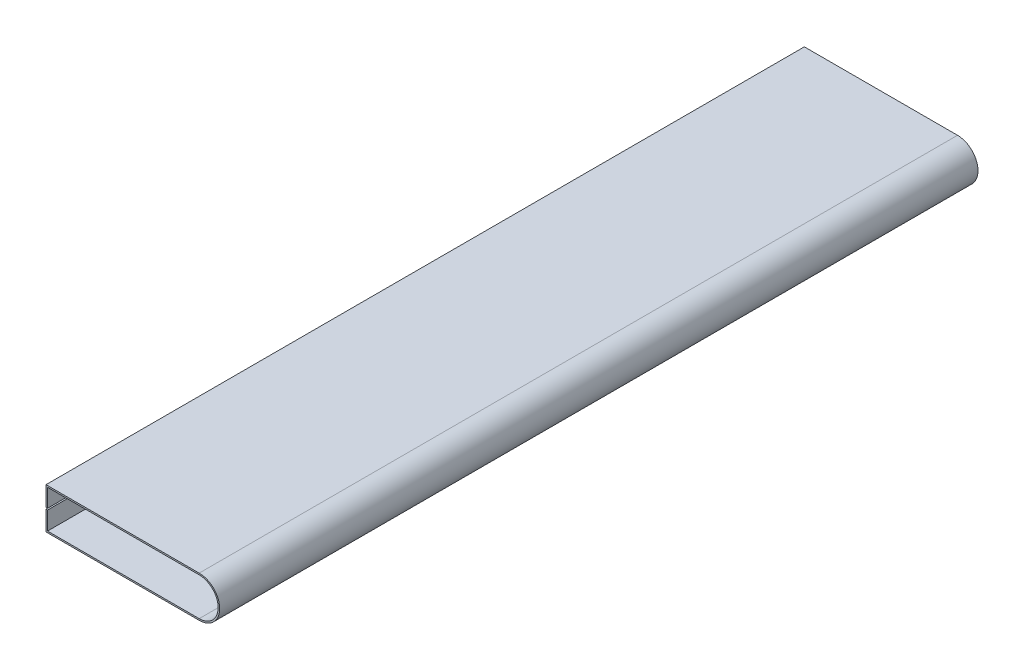
ISO-10303-21;
HEADER;
FILE_DESCRIPTION(('STEP AP214'),'2;1');
FILE_NAME('part.step','',(''),(''),'','','');
FILE_SCHEMA(('AUTOMOTIVE_DESIGN { 1 0 10303 214 1 1 1 1 }'));
ENDSEC;
DATA;
#1=APPLICATION_CONTEXT('core data for automotive mechanical design processes');
#2=APPLICATION_PROTOCOL_DEFINITION('international standard','automotive_design',2000,#1);
#3=PRODUCT_CONTEXT('',#1,'mechanical');
#4=PRODUCT('Part','Part','',(#3));
#5=PRODUCT_RELATED_PRODUCT_CATEGORY('part','',(#4));
#6=PRODUCT_DEFINITION_FORMATION('','',#4);
#7=PRODUCT_DEFINITION_CONTEXT('part definition',#1,'design');
#8=PRODUCT_DEFINITION('design','',#6,#7);
#9=PRODUCT_DEFINITION_SHAPE('','',#8);
#10=(LENGTH_UNIT() NAMED_UNIT(*) SI_UNIT(.MILLI.,.METRE.));
#11=(NAMED_UNIT(*) PLANE_ANGLE_UNIT() SI_UNIT($,.RADIAN.));
#12=(NAMED_UNIT(*) SI_UNIT($,.STERADIAN.) SOLID_ANGLE_UNIT());
#13=UNCERTAINTY_MEASURE_WITH_UNIT(LENGTH_MEASURE(1.E-05),#10,'distance_accuracy_value','');
#14=(GEOMETRIC_REPRESENTATION_CONTEXT(3) GLOBAL_UNCERTAINTY_ASSIGNED_CONTEXT((#13)) GLOBAL_UNIT_ASSIGNED_CONTEXT((#10,
#11,#12)) REPRESENTATION_CONTEXT('',''));
#15=CARTESIAN_POINT('',(0.,0.,0.));
#16=DIRECTION('',(0.,0.,1.));
#17=DIRECTION('',(1.,0.,0.));
#18=AXIS2_PLACEMENT_3D('',#15,#16,#17);
#19=CARTESIAN_POINT('',(-117.957004606919,70.1811228527202,-1000.));
#20=DIRECTION('',(1.,0.,0.));
#21=DIRECTION('',(0.,0.,-1.));
#22=AXIS2_PLACEMENT_3D('',#19,#20,#21);
#23=PLANE('',#22);
#24=DIRECTION('',(0.,1.,0.));
#25=VECTOR('',#24,1.);
#26=CARTESIAN_POINT('',(-117.957004606919,70.1811228527202,0.));
#27=LINE('',#26,#25);
#28=CARTESIAN_POINT('',(-117.957004606919,46.1811228527202,0.));
#29=VERTEX_POINT('',#28);
#30=CARTESIAN_POINT('',(-117.957004606919,70.1811228527202,0.));
#31=VERTEX_POINT('',#30);
#32=EDGE_CURVE('E162',#29,#31,#27,.T.);
#33=ORIENTED_EDGE('',*,*,#32,.F.);
#34=DIRECTION('',(0.,0.,1.));
#35=VECTOR('',#34,1.);
#36=CARTESIAN_POINT('',(-117.957004606919,46.1811228527202,-1000.));
#37=LINE('',#36,#35);
#38=CARTESIAN_POINT('',(-117.957004606919,46.1811228527202,-1000.));
#39=VERTEX_POINT('',#38);
#40=EDGE_CURVE('E11',#39,#29,#37,.T.);
#41=ORIENTED_EDGE('',*,*,#40,.F.);
#42=DIRECTION('',(0.,1.,0.));
#43=VECTOR('',#42,1.);
#44=CARTESIAN_POINT('',(-117.957004606919,70.1811228527202,-1000.));
#45=LINE('',#44,#43);
#46=CARTESIAN_POINT('',(-117.957004606919,70.1811228527202,-1000.));
#47=VERTEX_POINT('',#46);
#48=EDGE_CURVE('E194',#39,#47,#45,.T.);
#49=ORIENTED_EDGE('',*,*,#48,.T.);
#50=DIRECTION('',(0.,0.,1.));
#51=VECTOR('',#50,1.);
#52=CARTESIAN_POINT('',(-117.957004606919,70.1811228527202,-1000.));
#53=LINE('',#52,#51);
#54=EDGE_CURVE('E44',#47,#31,#53,.T.);
#55=ORIENTED_EDGE('',*,*,#54,.T.);
#56=EDGE_LOOP('',(#33,#41,#49,#55));
#57=FACE_BOUND('',#56,.T.);
#58=ADVANCED_FACE('F41',(#57),#23,.T.);
#59=CARTESIAN_POINT('',(-117.957004606919,46.1811228527202,-1000.));
#60=DIRECTION('',(0.,-1.,0.));
#61=DIRECTION('',(0.,0.,-1.));
#62=AXIS2_PLACEMENT_3D('',#59,#60,#61);
#63=PLANE('',#62);
#64=DIRECTION('',(1.,0.,0.));
#65=VECTOR('',#64,1.);
#66=CARTESIAN_POINT('',(-117.957004606919,46.1811228527202,0.));
#67=LINE('',#66,#65);
#68=CARTESIAN_POINT('',(-119.957004606919,46.1811228527202,0.));
#69=VERTEX_POINT('',#68);
#70=EDGE_CURVE('E192',#69,#29,#67,.T.);
#71=ORIENTED_EDGE('',*,*,#70,.F.);
#72=DIRECTION('',(0.,0.,1.));
#73=VECTOR('',#72,1.);
#74=CARTESIAN_POINT('',(-119.957004606919,46.1811228527202,-1000.));
#75=LINE('',#74,#73);
#76=CARTESIAN_POINT('',(-119.957004606919,46.1811228527202,-1000.));
#77=VERTEX_POINT('',#76);
#78=EDGE_CURVE('E50',#77,#69,#75,.T.);
#79=ORIENTED_EDGE('',*,*,#78,.F.);
#80=DIRECTION('',(1.,0.,0.));
#81=VECTOR('',#80,1.);
#82=CARTESIAN_POINT('',(-117.957004606919,46.1811228527202,-1000.));
#83=LINE('',#82,#81);
#84=EDGE_CURVE('E152',#77,#39,#83,.T.);
#85=ORIENTED_EDGE('',*,*,#84,.T.);
#86=ORIENTED_EDGE('',*,*,#40,.T.);
#87=EDGE_LOOP('',(#71,#79,#85,#86));
#88=FACE_BOUND('',#87,.T.);
#89=ADVANCED_FACE('F214',(#88),#63,.T.);
#90=CARTESIAN_POINT('',(-119.957004606919,72.1811228527202,-1000.));
#91=DIRECTION('',(-1.,0.,0.));
#92=DIRECTION('',(0.,0.,1.));
#93=AXIS2_PLACEMENT_3D('',#90,#91,#92);
#94=PLANE('',#93);
#95=DIRECTION('',(0.,-1.,0.));
#96=VECTOR('',#95,1.);
#97=CARTESIAN_POINT('',(-119.957004606919,72.1811228527202,0.));
#98=LINE('',#97,#96);
#99=CARTESIAN_POINT('',(-119.957004606919,72.1811228527202,0.));
#100=VERTEX_POINT('',#99);
#101=EDGE_CURVE('E139',#100,#69,#98,.T.);
#102=ORIENTED_EDGE('',*,*,#101,.F.);
#103=DIRECTION('',(0.,0.,1.));
#104=VECTOR('',#103,1.);
#105=CARTESIAN_POINT('',(-119.957004606919,72.1811228527202,-1000.));
#106=LINE('',#105,#104);
#107=CARTESIAN_POINT('',(-119.957004606919,72.1811228527202,-1000.));
#108=VERTEX_POINT('',#107);
#109=EDGE_CURVE('E134',#108,#100,#106,.T.);
#110=ORIENTED_EDGE('',*,*,#109,.F.);
#111=DIRECTION('',(0.,-1.,0.));
#112=VECTOR('',#111,1.);
#113=CARTESIAN_POINT('',(-119.957004606919,72.1811228527202,-1000.));
#114=LINE('',#113,#112);
#115=EDGE_CURVE('E137',#108,#77,#114,.T.);
#116=ORIENTED_EDGE('',*,*,#115,.T.);
#117=ORIENTED_EDGE('',*,*,#78,.T.);
#118=EDGE_LOOP('',(#102,#110,#116,#117));
#119=FACE_BOUND('',#118,.T.);
#120=ADVANCED_FACE('F136',(#119),#94,.T.);
#121=CARTESIAN_POINT('',(-119.957004606919,72.1811228527202,-1000.));
#122=DIRECTION('',(0.,1.,0.));
#123=DIRECTION('',(0.,0.,1.));
#124=AXIS2_PLACEMENT_3D('',#121,#122,#123);
#125=PLANE('',#124);
#126=DIRECTION('',(-1.,0.,0.));
#127=VECTOR('',#126,1.);
#128=CARTESIAN_POINT('',(-119.957004606919,72.1811228527202,0.));
#129=LINE('',#128,#127);
#130=CARTESIAN_POINT('',(82.0429953930805,72.1811228527202,0.));
#131=VERTEX_POINT('',#130);
#132=EDGE_CURVE('E189',#131,#100,#129,.T.);
#133=ORIENTED_EDGE('',*,*,#132,.F.);
#134=DIRECTION('',(0.,0.,1.));
#135=VECTOR('',#134,1.);
#136=CARTESIAN_POINT('',(82.0429953930805,72.1811228527202,-1000.));
#137=LINE('',#136,#135);
#138=CARTESIAN_POINT('',(82.0429953930805,72.1811228527202,-1000.));
#139=VERTEX_POINT('',#138);
#140=EDGE_CURVE('E144',#139,#131,#137,.T.);
#141=ORIENTED_EDGE('',*,*,#140,.F.);
#142=DIRECTION('',(-1.,0.,0.));
#143=VECTOR('',#142,1.);
#144=CARTESIAN_POINT('',(-119.957004606919,72.1811228527202,-1000.));
#145=LINE('',#144,#143);
#146=EDGE_CURVE('E150',#139,#108,#145,.T.);
#147=ORIENTED_EDGE('',*,*,#146,.T.);
#148=ORIENTED_EDGE('',*,*,#109,.T.);
#149=EDGE_LOOP('',(#133,#141,#147,#148));
#150=FACE_BOUND('',#149,.T.);
#151=ADVANCED_FACE('F154',(#150),#125,.T.);
#152=CARTESIAN_POINT('',(82.0429953930805,45.1811228527202,-1000.));
#153=DIRECTION('',(0.,0.,1.));
#154=DIRECTION('',(1.,0.,0.));
#155=AXIS2_PLACEMENT_3D('',#152,#153,#154);
#156=CYLINDRICAL_SURFACE('',#155,27.);
#157=CARTESIAN_POINT('',(82.0429953930805,45.1811228527202,0.));
#158=DIRECTION('',(0.,0.,1.));
#159=DIRECTION('',(-1.,0.,0.));
#160=AXIS2_PLACEMENT_3D('',#157,#158,#159);
#161=CIRCLE('',#160,27.);
#162=CARTESIAN_POINT('',(82.0429953930805,18.1811228527202,0.));
#163=VERTEX_POINT('',#162);
#164=EDGE_CURVE('E186',#163,#131,#161,.T.);
#165=ORIENTED_EDGE('',*,*,#164,.F.);
#166=DIRECTION('',(0.,0.,1.));
#167=VECTOR('',#166,1.);
#168=CARTESIAN_POINT('',(82.0429953930805,18.1811228527202,-1000.));
#169=LINE('',#168,#167);
#170=CARTESIAN_POINT('',(82.0429953930805,18.1811228527202,-1000.));
#171=VERTEX_POINT('',#170);
#172=EDGE_CURVE('E198',#171,#163,#169,.T.);
#173=ORIENTED_EDGE('',*,*,#172,.F.);
#174=CARTESIAN_POINT('',(82.0429953930805,45.1811228527202,-1000.));
#175=DIRECTION('',(0.,0.,1.));
#176=DIRECTION('',(-1.,0.,0.));
#177=AXIS2_PLACEMENT_3D('',#174,#175,#176);
#178=CIRCLE('',#177,27.);
#179=EDGE_CURVE('E155',#171,#139,#178,.T.);
#180=ORIENTED_EDGE('',*,*,#179,.T.);
#181=ORIENTED_EDGE('',*,*,#140,.T.);
#182=EDGE_LOOP('',(#165,#173,#180,#181));
#183=FACE_BOUND('',#182,.T.);
#184=ADVANCED_FACE('F227',(#183),#156,.T.);
#185=CARTESIAN_POINT('',(-119.957004606919,18.1811228527202,-1000.));
#186=DIRECTION('',(0.,-1.,0.));
#187=DIRECTION('',(0.,0.,-1.));
#188=AXIS2_PLACEMENT_3D('',#185,#186,#187);
#189=PLANE('',#188);
#190=DIRECTION('',(1.,0.,0.));
#191=VECTOR('',#190,1.);
#192=CARTESIAN_POINT('',(-119.957004606919,18.1811228527202,0.));
#193=LINE('',#192,#191);
#194=CARTESIAN_POINT('',(-119.957004606919,18.1811228527202,0.));
#195=VERTEX_POINT('',#194);
#196=EDGE_CURVE('E183',#195,#163,#193,.T.);
#197=ORIENTED_EDGE('',*,*,#196,.F.);
#198=DIRECTION('',(0.,0.,1.));
#199=VECTOR('',#198,1.);
#200=CARTESIAN_POINT('',(-119.957004606919,18.1811228527202,-1000.));
#201=LINE('',#200,#199);
#202=CARTESIAN_POINT('',(-119.957004606919,18.1811228527202,-1000.));
#203=VERTEX_POINT('',#202);
#204=EDGE_CURVE('E200',#203,#195,#201,.T.);
#205=ORIENTED_EDGE('',*,*,#204,.F.);
#206=DIRECTION('',(1.,0.,0.));
#207=VECTOR('',#206,1.);
#208=CARTESIAN_POINT('',(-119.957004606919,18.1811228527202,-1000.));
#209=LINE('',#208,#207);
#210=EDGE_CURVE('E157',#203,#171,#209,.T.);
#211=ORIENTED_EDGE('',*,*,#210,.T.);
#212=ORIENTED_EDGE('',*,*,#172,.T.);
#213=EDGE_LOOP('',(#197,#205,#211,#212));
#214=FACE_BOUND('',#213,.T.);
#215=ADVANCED_FACE('F230',(#214),#189,.T.);
#216=CARTESIAN_POINT('',(-119.957004606919,44.1811228527202,-1000.));
#217=DIRECTION('',(-1.,0.,0.));
#218=DIRECTION('',(0.,0.,1.));
#219=AXIS2_PLACEMENT_3D('',#216,#217,#218);
#220=PLANE('',#219);
#221=DIRECTION('',(0.,-1.,0.));
#222=VECTOR('',#221,1.);
#223=CARTESIAN_POINT('',(-119.957004606919,44.1811228527202,0.));
#224=LINE('',#223,#222);
#225=CARTESIAN_POINT('',(-119.957004606919,44.1811228527202,0.));
#226=VERTEX_POINT('',#225);
#227=EDGE_CURVE('E180',#226,#195,#224,.T.);
#228=ORIENTED_EDGE('',*,*,#227,.F.);
#229=DIRECTION('',(0.,0.,1.));
#230=VECTOR('',#229,1.);
#231=CARTESIAN_POINT('',(-119.957004606919,44.1811228527202,-1000.));
#232=LINE('',#231,#230);
#233=CARTESIAN_POINT('',(-119.957004606919,44.1811228527202,-1000.));
#234=VERTEX_POINT('',#233);
#235=EDGE_CURVE('E202',#234,#226,#232,.T.);
#236=ORIENTED_EDGE('',*,*,#235,.F.);
#237=DIRECTION('',(0.,-1.,0.));
#238=VECTOR('',#237,1.);
#239=CARTESIAN_POINT('',(-119.957004606919,44.1811228527202,-1000.));
#240=LINE('',#239,#238);
#241=EDGE_CURVE('E364',#234,#203,#240,.T.);
#242=ORIENTED_EDGE('',*,*,#241,.T.);
#243=ORIENTED_EDGE('',*,*,#204,.T.);
#244=EDGE_LOOP('',(#228,#236,#242,#243));
#245=FACE_BOUND('',#244,.T.);
#246=ADVANCED_FACE('F234',(#245),#220,.T.);
#247=CARTESIAN_POINT('',(-117.957004606919,44.1811228527202,-1000.));
#248=DIRECTION('',(0.,1.,0.));
#249=DIRECTION('',(0.,0.,1.));
#250=AXIS2_PLACEMENT_3D('',#247,#248,#249);
#251=PLANE('',#250);
#252=DIRECTION('',(-1.,0.,0.));
#253=VECTOR('',#252,1.);
#254=CARTESIAN_POINT('',(-117.957004606919,44.1811228527202,0.));
#255=LINE('',#254,#253);
#256=CARTESIAN_POINT('',(-117.957004606919,44.1811228527202,0.));
#257=VERTEX_POINT('',#256);
#258=EDGE_CURVE('E177',#257,#226,#255,.T.);
#259=ORIENTED_EDGE('',*,*,#258,.F.);
#260=DIRECTION('',(0.,0.,1.));
#261=VECTOR('',#260,1.);
#262=CARTESIAN_POINT('',(-117.957004606919,44.1811228527202,-1000.));
#263=LINE('',#262,#261);
#264=CARTESIAN_POINT('',(-117.957004606919,44.1811228527202,-1000.));
#265=VERTEX_POINT('',#264);
#266=EDGE_CURVE('E204',#265,#257,#263,.T.);
#267=ORIENTED_EDGE('',*,*,#266,.F.);
#268=DIRECTION('',(-1.,0.,0.));
#269=VECTOR('',#268,1.);
#270=CARTESIAN_POINT('',(-117.957004606919,44.1811228527202,-1000.));
#271=LINE('',#270,#269);
#272=EDGE_CURVE('E368',#265,#234,#271,.T.);
#273=ORIENTED_EDGE('',*,*,#272,.T.);
#274=ORIENTED_EDGE('',*,*,#235,.T.);
#275=EDGE_LOOP('',(#259,#267,#273,#274));
#276=FACE_BOUND('',#275,.T.);
#277=ADVANCED_FACE('F238',(#276),#251,.T.);
#278=CARTESIAN_POINT('',(-117.957004606919,44.1811228527202,-1000.));
#279=DIRECTION('',(1.,0.,0.));
#280=DIRECTION('',(0.,1.,0.));
#281=AXIS2_PLACEMENT_3D('',#278,#279,#280);
#282=PLANE('',#281);
#283=DIRECTION('',(0.,1.,0.));
#284=VECTOR('',#283,1.);
#285=CARTESIAN_POINT('',(-117.957004606919,44.1811228527202,0.));
#286=LINE('',#285,#284);
#287=CARTESIAN_POINT('',(-117.957004606919,20.1811228527202,0.));
#288=VERTEX_POINT('',#287);
#289=EDGE_CURVE('E174',#288,#257,#286,.T.);
#290=ORIENTED_EDGE('',*,*,#289,.F.);
#291=DIRECTION('',(0.,0.,1.));
#292=VECTOR('',#291,1.);
#293=CARTESIAN_POINT('',(-117.957004606919,20.1811228527202,-1000.));
#294=LINE('',#293,#292);
#295=CARTESIAN_POINT('',(-117.957004606919,20.1811228527202,-1000.));
#296=VERTEX_POINT('',#295);
#297=EDGE_CURVE('E206',#296,#288,#294,.T.);
#298=ORIENTED_EDGE('',*,*,#297,.F.);
#299=DIRECTION('',(0.,1.,0.));
#300=VECTOR('',#299,1.);
#301=CARTESIAN_POINT('',(-117.957004606919,44.1811228527202,-1000.));
#302=LINE('',#301,#300);
#303=EDGE_CURVE('E357',#296,#265,#302,.T.);
#304=ORIENTED_EDGE('',*,*,#303,.T.);
#305=ORIENTED_EDGE('',*,*,#266,.T.);
#306=EDGE_LOOP('',(#290,#298,#304,#305));
#307=FACE_BOUND('',#306,.T.);
#308=ADVANCED_FACE('F242',(#307),#282,.T.);
#309=CARTESIAN_POINT('',(-117.957004606919,20.1811228527202,-1000.));
#310=DIRECTION('',(0.,1.,0.));
#311=DIRECTION('',(0.,0.,1.));
#312=AXIS2_PLACEMENT_3D('',#309,#310,#311);
#313=PLANE('',#312);
#314=DIRECTION('',(-1.,0.,0.));
#315=VECTOR('',#314,1.);
#316=CARTESIAN_POINT('',(-117.957004606919,20.1811228527202,0.));
#317=LINE('',#316,#315);
#318=CARTESIAN_POINT('',(82.0429953930806,20.1811228527202,0.));
#319=VERTEX_POINT('',#318);
#320=EDGE_CURVE('E171',#319,#288,#317,.T.);
#321=ORIENTED_EDGE('',*,*,#320,.F.);
#322=DIRECTION('',(0.,0.,1.));
#323=VECTOR('',#322,1.);
#324=CARTESIAN_POINT('',(82.0429953930806,20.1811228527202,-1000.));
#325=LINE('',#324,#323);
#326=CARTESIAN_POINT('',(82.0429953930806,20.1811228527202,-1000.));
#327=VERTEX_POINT('',#326);
#328=EDGE_CURVE('E208',#327,#319,#325,.T.);
#329=ORIENTED_EDGE('',*,*,#328,.F.);
#330=DIRECTION('',(-1.,0.,0.));
#331=VECTOR('',#330,1.);
#332=CARTESIAN_POINT('',(-117.957004606919,20.1811228527202,-1000.));
#333=LINE('',#332,#331);
#334=EDGE_CURVE('E353',#327,#296,#333,.T.);
#335=ORIENTED_EDGE('',*,*,#334,.T.);
#336=ORIENTED_EDGE('',*,*,#297,.T.);
#337=EDGE_LOOP('',(#321,#329,#335,#336));
#338=FACE_BOUND('',#337,.T.);
#339=ADVANCED_FACE('F246',(#338),#313,.T.);
#340=CARTESIAN_POINT('',(82.0429953930805,45.1811228527202,-1000.));
#341=DIRECTION('',(0.,0.,1.));
#342=DIRECTION('',(1.,0.,0.));
#343=AXIS2_PLACEMENT_3D('',#340,#341,#342);
#344=CYLINDRICAL_SURFACE('',#343,25.);
#345=CARTESIAN_POINT('',(82.0429953930805,45.1811228527202,0.));
#346=DIRECTION('',(0.,0.,-1.));
#347=DIRECTION('',(-1.,0.,0.));
#348=AXIS2_PLACEMENT_3D('',#345,#346,#347);
#349=CIRCLE('',#348,25.);
#350=CARTESIAN_POINT('',(82.0429953930805,70.1811228527202,0.));
#351=VERTEX_POINT('',#350);
#352=EDGE_CURVE('E168',#351,#319,#349,.T.);
#353=ORIENTED_EDGE('',*,*,#352,.F.);
#354=DIRECTION('',(0.,0.,1.));
#355=VECTOR('',#354,1.);
#356=CARTESIAN_POINT('',(82.0429953930805,70.1811228527202,-1000.));
#357=LINE('',#356,#355);
#358=CARTESIAN_POINT('',(82.0429953930805,70.1811228527202,-1000.));
#359=VERTEX_POINT('',#358);
#360=EDGE_CURVE('E209',#359,#351,#357,.T.);
#361=ORIENTED_EDGE('',*,*,#360,.F.);
#362=CARTESIAN_POINT('',(82.0429953930805,45.1811228527202,-1000.));
#363=DIRECTION('',(0.,0.,-1.));
#364=DIRECTION('',(-1.,0.,0.));
#365=AXIS2_PLACEMENT_3D('',#362,#363,#364);
#366=CIRCLE('',#365,25.);
#367=EDGE_CURVE('E374',#359,#327,#366,.T.);
#368=ORIENTED_EDGE('',*,*,#367,.T.);
#369=ORIENTED_EDGE('',*,*,#328,.T.);
#370=EDGE_LOOP('',(#353,#361,#368,#369));
#371=FACE_BOUND('',#370,.T.);
#372=ADVANCED_FACE('F250',(#371),#344,.F.);
#373=CARTESIAN_POINT('',(-117.957004606919,70.1811228527202,-1000.));
#374=DIRECTION('',(0.,-1.,0.));
#375=DIRECTION('',(0.,0.,-1.));
#376=AXIS2_PLACEMENT_3D('',#373,#374,#375);
#377=PLANE('',#376);
#378=DIRECTION('',(1.,0.,0.));
#379=VECTOR('',#378,1.);
#380=CARTESIAN_POINT('',(-117.957004606919,70.1811228527202,0.));
#381=LINE('',#380,#379);
#382=EDGE_CURVE('E165',#31,#351,#381,.T.);
#383=ORIENTED_EDGE('',*,*,#382,.F.);
#384=ORIENTED_EDGE('',*,*,#54,.F.);
#385=DIRECTION('',(1.,0.,0.));
#386=VECTOR('',#385,1.);
#387=CARTESIAN_POINT('',(-117.957004606919,70.1811228527202,-1000.));
#388=LINE('',#387,#386);
#389=EDGE_CURVE('E376',#47,#359,#388,.T.);
#390=ORIENTED_EDGE('',*,*,#389,.T.);
#391=ORIENTED_EDGE('',*,*,#360,.T.);
#392=EDGE_LOOP('',(#383,#384,#390,#391));
#393=FACE_BOUND('',#392,.T.);
#394=ADVANCED_FACE('F211',(#393),#377,.T.);
#395=CARTESIAN_POINT('',(82.0429953930805,45.1811228527202,-1000.));
#396=DIRECTION('',(0.,0.,-1.));
#397=DIRECTION('',(-1.,0.,0.));
#398=AXIS2_PLACEMENT_3D('',#395,#396,#397);
#399=PLANE('',#398);
#400=ORIENTED_EDGE('',*,*,#48,.F.);
#401=ORIENTED_EDGE('',*,*,#84,.F.);
#402=ORIENTED_EDGE('',*,*,#115,.F.);
#403=ORIENTED_EDGE('',*,*,#146,.F.);
#404=ORIENTED_EDGE('',*,*,#179,.F.);
#405=ORIENTED_EDGE('',*,*,#210,.F.);
#406=ORIENTED_EDGE('',*,*,#241,.F.);
#407=ORIENTED_EDGE('',*,*,#272,.F.);
#408=ORIENTED_EDGE('',*,*,#303,.F.);
#409=ORIENTED_EDGE('',*,*,#334,.F.);
#410=ORIENTED_EDGE('',*,*,#367,.F.);
#411=ORIENTED_EDGE('',*,*,#389,.F.);
#412=EDGE_LOOP('',(#400,#401,#402,#403,#404,#405,#406,#407,#408,#409,#410,#411));
#413=FACE_BOUND('',#412,.T.);
#414=ADVANCED_FACE('F148',(#413),#399,.T.);
#415=CARTESIAN_POINT('',(82.0429953930805,45.1811228527202,0.));
#416=DIRECTION('',(0.,0.,-1.));
#417=DIRECTION('',(-1.,0.,0.));
#418=AXIS2_PLACEMENT_3D('',#415,#416,#417);
#419=PLANE('',#418);
#420=ORIENTED_EDGE('',*,*,#32,.T.);
#421=ORIENTED_EDGE('',*,*,#382,.T.);
#422=ORIENTED_EDGE('',*,*,#352,.T.);
#423=ORIENTED_EDGE('',*,*,#320,.T.);
#424=ORIENTED_EDGE('',*,*,#289,.T.);
#425=ORIENTED_EDGE('',*,*,#258,.T.);
#426=ORIENTED_EDGE('',*,*,#227,.T.);
#427=ORIENTED_EDGE('',*,*,#196,.T.);
#428=ORIENTED_EDGE('',*,*,#164,.T.);
#429=ORIENTED_EDGE('',*,*,#132,.T.);
#430=ORIENTED_EDGE('',*,*,#101,.T.);
#431=ORIENTED_EDGE('',*,*,#70,.T.);
#432=EDGE_LOOP('',(#420,#421,#422,#423,#424,#425,#426,#427,#428,#429,#430,#431));
#433=FACE_BOUND('',#432,.T.);
#434=ADVANCED_FACE('F213',(#433),#419,.F.);
#435=CLOSED_SHELL('',(#58,#89,#120,#151,#184,#215,#246,#277,#308,#339,#372,#394,#414,#434));
#436=MANIFOLD_SOLID_BREP('B2',#435);
#437=ADVANCED_BREP_SHAPE_REPRESENTATION('',(#18,#436),#14);
#438=SHAPE_DEFINITION_REPRESENTATION(#9,#437);
ENDSEC;
END-ISO-10303-21;
